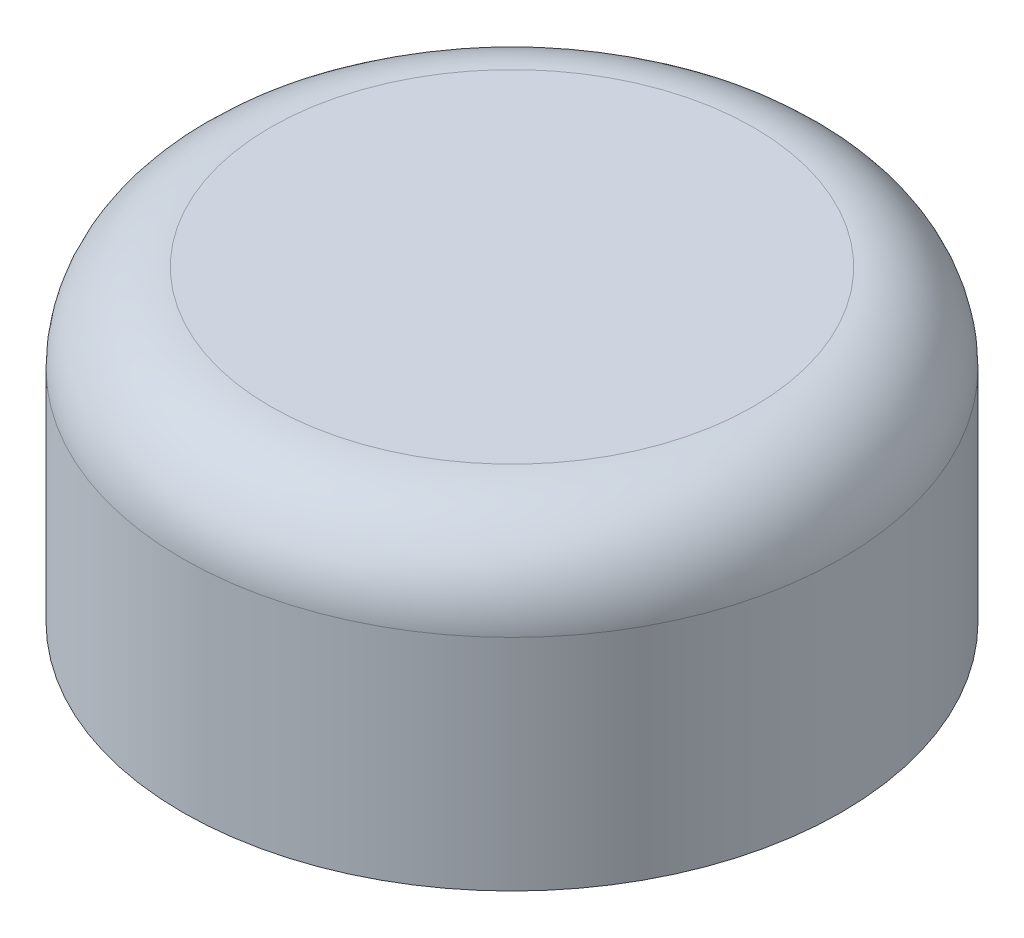
ISO-10303-21;
HEADER;
FILE_DESCRIPTION(('STEP AP214'),'2;1');
FILE_NAME('part.step','',(''),(''),'','','');
FILE_SCHEMA(('AUTOMOTIVE_DESIGN { 1 0 10303 214 1 1 1 1 }'));
ENDSEC;
DATA;
#1=APPLICATION_CONTEXT('core data for automotive mechanical design processes');
#2=APPLICATION_PROTOCOL_DEFINITION('international standard','automotive_design',2000,#1);
#3=PRODUCT_CONTEXT('',#1,'mechanical');
#4=PRODUCT('Part','Part','',(#3));
#5=PRODUCT_RELATED_PRODUCT_CATEGORY('part','',(#4));
#6=PRODUCT_DEFINITION_FORMATION('','',#4);
#7=PRODUCT_DEFINITION_CONTEXT('part definition',#1,'design');
#8=PRODUCT_DEFINITION('design','',#6,#7);
#9=PRODUCT_DEFINITION_SHAPE('','',#8);
#10=(LENGTH_UNIT() NAMED_UNIT(*) SI_UNIT(.MILLI.,.METRE.));
#11=(NAMED_UNIT(*) PLANE_ANGLE_UNIT() SI_UNIT($,.RADIAN.));
#12=(NAMED_UNIT(*) SI_UNIT($,.STERADIAN.) SOLID_ANGLE_UNIT());
#13=UNCERTAINTY_MEASURE_WITH_UNIT(LENGTH_MEASURE(1.E-05),#10,'distance_accuracy_value','');
#14=(GEOMETRIC_REPRESENTATION_CONTEXT(3) GLOBAL_UNCERTAINTY_ASSIGNED_CONTEXT((#13)) GLOBAL_UNIT_ASSIGNED_CONTEXT((#10,
#11,#12)) REPRESENTATION_CONTEXT('',''));
#15=CARTESIAN_POINT('',(0.,0.,0.));
#16=DIRECTION('',(0.,0.,1.));
#17=DIRECTION('',(1.,0.,0.));
#18=AXIS2_PLACEMENT_3D('',#15,#16,#17);
#19=CARTESIAN_POINT('',(0.,17.5,0.));
#20=DIRECTION('',(0.,-1.,0.));
#21=DIRECTION('',(0.,0.,-1.));
#22=AXIS2_PLACEMENT_3D('',#19,#20,#21);
#23=CYLINDRICAL_SURFACE('',#22,37.5);
#24=CARTESIAN_POINT('',(0.,7.5,0.));
#25=DIRECTION('',(0.,1.,0.));
#26=DIRECTION('',(0.,0.,1.));
#27=AXIS2_PLACEMENT_3D('',#24,#25,#26);
#28=CIRCLE('',#27,37.5);
#29=CARTESIAN_POINT('',(0.,7.5,37.5));
#30=VERTEX_POINT('',#29);
#31=EDGE_CURVE('E10',#30,#30,#28,.F.);
#32=ORIENTED_EDGE('',*,*,#31,.T.);
#33=EDGE_LOOP('',(#32));
#34=FACE_BOUND('',#33,.T.);
#35=CARTESIAN_POINT('',(0.,-17.5,0.));
#36=DIRECTION('',(0.,1.,0.));
#37=DIRECTION('',(0.,0.,1.));
#38=AXIS2_PLACEMENT_3D('',#35,#36,#37);
#39=CIRCLE('',#38,37.5);
#40=CARTESIAN_POINT('',(0.,-17.5,37.5));
#41=VERTEX_POINT('',#40);
#42=EDGE_CURVE('E45',#41,#41,#39,.T.);
#43=ORIENTED_EDGE('',*,*,#42,.T.);
#44=EDGE_LOOP('',(#43));
#45=FACE_BOUND('',#44,.T.);
#46=ADVANCED_FACE('F34',(#34,#45),#23,.T.);
#47=CARTESIAN_POINT('',(0.,17.5,0.));
#48=DIRECTION('',(0.,1.,0.));
#49=DIRECTION('',(0.,0.,1.));
#50=AXIS2_PLACEMENT_3D('',#47,#48,#49);
#51=PLANE('',#50);
#52=CARTESIAN_POINT('',(0.,17.5,0.));
#53=DIRECTION('',(0.,1.,0.));
#54=DIRECTION('',(0.,0.,1.));
#55=AXIS2_PLACEMENT_3D('',#52,#53,#54);
#56=CIRCLE('',#55,27.5);
#57=CARTESIAN_POINT('',(0.,17.5,27.5));
#58=VERTEX_POINT('',#57);
#59=EDGE_CURVE('E41',#58,#58,#56,.T.);
#60=ORIENTED_EDGE('',*,*,#59,.T.);
#61=EDGE_LOOP('',(#60));
#62=FACE_BOUND('',#61,.T.);
#63=ADVANCED_FACE('F55',(#62),#51,.T.);
#64=CARTESIAN_POINT('',(0.,-17.5,0.));
#65=DIRECTION('',(0.,1.,0.));
#66=DIRECTION('',(0.,0.,1.));
#67=AXIS2_PLACEMENT_3D('',#64,#65,#66);
#68=PLANE('',#67);
#69=ORIENTED_EDGE('',*,*,#42,.F.);
#70=EDGE_LOOP('',(#69));
#71=FACE_BOUND('',#70,.T.);
#72=ADVANCED_FACE('F53',(#71),#68,.F.);
#73=CARTESIAN_POINT('',(0.,7.5,0.));
#74=DIRECTION('',(0.,1.,0.));
#75=DIRECTION('',(0.,0.,1.));
#76=AXIS2_PLACEMENT_3D('',#73,#74,#75);
#77=TOROIDAL_SURFACE('',#76,27.5,10.);
#78=ORIENTED_EDGE('',*,*,#31,.F.);
#79=EDGE_LOOP('',(#78));
#80=FACE_BOUND('',#79,.T.);
#81=ORIENTED_EDGE('',*,*,#59,.F.);
#82=EDGE_LOOP('',(#81));
#83=FACE_BOUND('',#82,.T.);
#84=ADVANCED_FACE('F36',(#80,#83),#77,.T.);
#85=CLOSED_SHELL('',(#46,#63,#72,#84));
#86=MANIFOLD_SOLID_BREP('B2',#85);
#87=ADVANCED_BREP_SHAPE_REPRESENTATION('',(#18,#86),#14);
#88=SHAPE_DEFINITION_REPRESENTATION(#9,#87);
ENDSEC;
END-ISO-10303-21;
